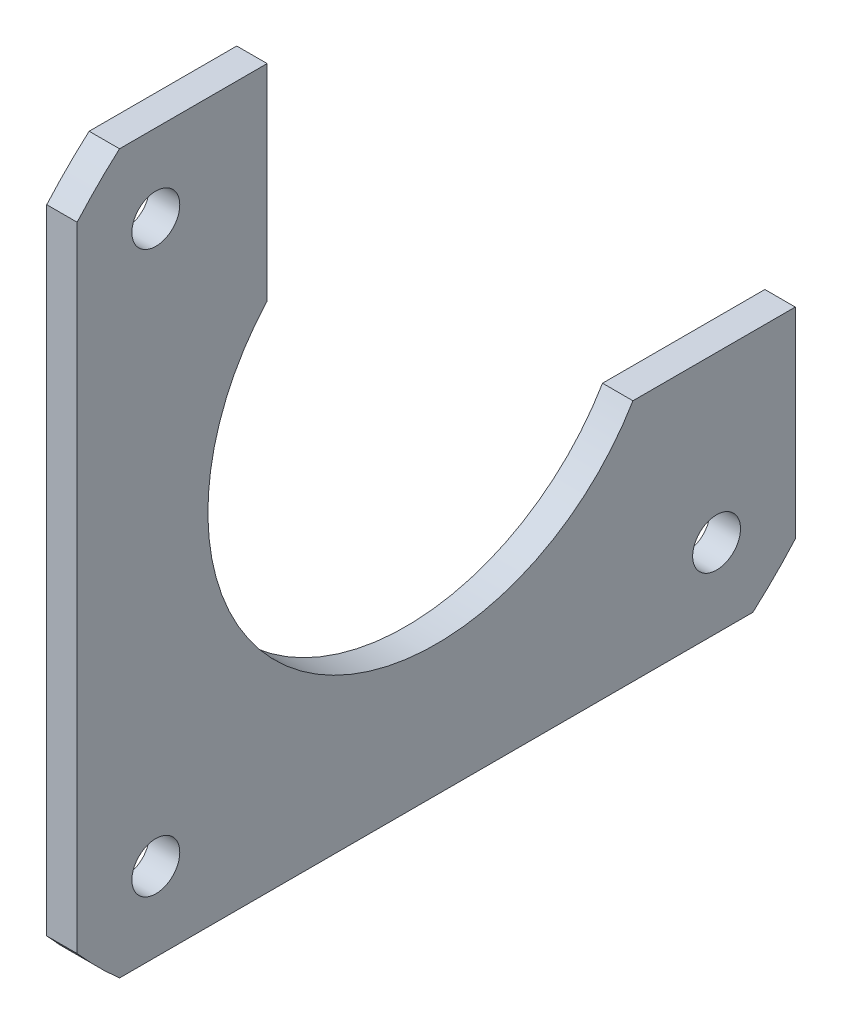
ISO-10303-21;
HEADER;
FILE_DESCRIPTION(('STEP AP214'),'2;1');
FILE_NAME('part.step','',(''),(''),'','','');
FILE_SCHEMA(('AUTOMOTIVE_DESIGN { 1 0 10303 214 1 1 1 1 }'));
ENDSEC;
DATA;
#1=APPLICATION_CONTEXT('core data for automotive mechanical design processes');
#2=APPLICATION_PROTOCOL_DEFINITION('international standard','automotive_design',2000,#1);
#3=PRODUCT_CONTEXT('',#1,'mechanical');
#4=PRODUCT('Part','Part','',(#3));
#5=PRODUCT_RELATED_PRODUCT_CATEGORY('part','',(#4));
#6=PRODUCT_DEFINITION_FORMATION('','',#4);
#7=PRODUCT_DEFINITION_CONTEXT('part definition',#1,'design');
#8=PRODUCT_DEFINITION('design','',#6,#7);
#9=PRODUCT_DEFINITION_SHAPE('','',#8);
#10=(LENGTH_UNIT() NAMED_UNIT(*) SI_UNIT(.MILLI.,.METRE.));
#11=(NAMED_UNIT(*) PLANE_ANGLE_UNIT() SI_UNIT($,.RADIAN.));
#12=(NAMED_UNIT(*) SI_UNIT($,.STERADIAN.) SOLID_ANGLE_UNIT());
#13=UNCERTAINTY_MEASURE_WITH_UNIT(LENGTH_MEASURE(1.E-05),#10,'distance_accuracy_value','');
#14=(GEOMETRIC_REPRESENTATION_CONTEXT(3) GLOBAL_UNCERTAINTY_ASSIGNED_CONTEXT((#13)) GLOBAL_UNIT_ASSIGNED_CONTEXT((#10,
#11,#12)) REPRESENTATION_CONTEXT('',''));
#15=CARTESIAN_POINT('',(0.,0.,0.));
#16=DIRECTION('',(0.,0.,1.));
#17=DIRECTION('',(1.,0.,0.));
#18=AXIS2_PLACEMENT_3D('',#15,#16,#17);
#19=CARTESIAN_POINT('',(2.54,0.,0.));
#20=DIRECTION('',(1.,0.,0.));
#21=DIRECTION('',(0.,0.,-1.));
#22=AXIS2_PLACEMENT_3D('',#19,#20,#21);
#23=PLANE('',#22);
#24=DIRECTION('',(0.,0.,-1.));
#25=VECTOR('',#24,1.);
#26=CARTESIAN_POINT('',(2.54,-9.67999999999999,-16.4363385521229));
#27=LINE('',#26,#25);
#28=CARTESIAN_POINT('',(2.54,-9.67999999999999,-16.4363385521229));
#29=VERTEX_POINT('',#28);
#30=CARTESIAN_POINT('',(2.54,-9.67999999999999,-30.));
#31=VERTEX_POINT('',#30);
#32=EDGE_CURVE('E119',#29,#31,#27,.T.);
#33=ORIENTED_EDGE('',*,*,#32,.F.);
#34=CARTESIAN_POINT('',(2.54,0.,0.));
#35=DIRECTION('',(1.,0.,0.));
#36=DIRECTION('',(0.,0.,-1.));
#37=AXIS2_PLACEMENT_3D('',#34,#35,#36);
#38=CIRCLE('',#37,19.075);
#39=CARTESIAN_POINT('',(2.54,12.8195163715329,14.125));
#40=VERTEX_POINT('',#39);
#41=EDGE_CURVE('E132',#40,#29,#38,.T.);
#42=ORIENTED_EDGE('',*,*,#41,.F.);
#43=DIRECTION('',(0.,-1.,0.));
#44=VECTOR('',#43,1.);
#45=CARTESIAN_POINT('',(2.54,30.,14.125));
#46=LINE('',#45,#44);
#47=CARTESIAN_POINT('',(2.54,30.,14.125));
#48=VERTEX_POINT('',#47);
#49=EDGE_CURVE('E58',#48,#40,#46,.T.);
#50=ORIENTED_EDGE('',*,*,#49,.F.);
#51=DIRECTION('',(0.,0.,1.));
#52=VECTOR('',#51,1.);
#53=CARTESIAN_POINT('',(2.54,30.,-26.4575131106459));
#54=LINE('',#53,#52);
#55=CARTESIAN_POINT('',(2.54,30.,26.4575131106459));
#56=VERTEX_POINT('',#55);
#57=EDGE_CURVE('E125',#48,#56,#54,.T.);
#58=ORIENTED_EDGE('',*,*,#57,.T.);
#59=CARTESIAN_POINT('',(2.54,0.,0.));
#60=DIRECTION('',(1.,0.,0.));
#61=DIRECTION('',(0.,0.,-1.));
#62=AXIS2_PLACEMENT_3D('',#59,#60,#61);
#63=CIRCLE('',#62,40.);
#64=CARTESIAN_POINT('',(2.54,26.4575131106459,30.));
#65=VERTEX_POINT('',#64);
#66=EDGE_CURVE('E193',#56,#65,#63,.T.);
#67=ORIENTED_EDGE('',*,*,#66,.T.);
#68=DIRECTION('',(0.,-1.,0.));
#69=VECTOR('',#68,1.);
#70=CARTESIAN_POINT('',(2.54,26.4575131106459,30.));
#71=LINE('',#70,#69);
#72=CARTESIAN_POINT('',(2.54,-26.4575131106459,30.));
#73=VERTEX_POINT('',#72);
#74=EDGE_CURVE('E170',#65,#73,#71,.T.);
#75=ORIENTED_EDGE('',*,*,#74,.T.);
#76=CARTESIAN_POINT('',(2.54,0.,0.));
#77=DIRECTION('',(1.,0.,0.));
#78=DIRECTION('',(0.,0.,-1.));
#79=AXIS2_PLACEMENT_3D('',#76,#77,#78);
#80=CIRCLE('',#79,40.);
#81=CARTESIAN_POINT('',(2.54,-30.,26.4575131106459));
#82=VERTEX_POINT('',#81);
#83=EDGE_CURVE('E188',#73,#82,#80,.T.);
#84=ORIENTED_EDGE('',*,*,#83,.T.);
#85=DIRECTION('',(0.,0.,-1.));
#86=VECTOR('',#85,1.);
#87=CARTESIAN_POINT('',(2.54,-30.,26.4575131106459));
#88=LINE('',#87,#86);
#89=CARTESIAN_POINT('',(2.54,-30.,-26.4575131106459));
#90=VERTEX_POINT('',#89);
#91=EDGE_CURVE('E184',#82,#90,#88,.T.);
#92=ORIENTED_EDGE('',*,*,#91,.T.);
#93=CARTESIAN_POINT('',(2.54,0.,0.));
#94=DIRECTION('',(1.,0.,0.));
#95=DIRECTION('',(0.,0.,-1.));
#96=AXIS2_PLACEMENT_3D('',#93,#94,#95);
#97=CIRCLE('',#96,40.);
#98=CARTESIAN_POINT('',(2.54,-26.4575131106459,-30.));
#99=VERTEX_POINT('',#98);
#100=EDGE_CURVE('E187',#90,#99,#97,.T.);
#101=ORIENTED_EDGE('',*,*,#100,.T.);
#102=DIRECTION('',(0.,1.,0.));
#103=VECTOR('',#102,1.);
#104=CARTESIAN_POINT('',(2.54,-26.4575131106459,-30.));
#105=LINE('',#104,#103);
#106=EDGE_CURVE('E140',#99,#31,#105,.T.);
#107=ORIENTED_EDGE('',*,*,#106,.T.);
#108=EDGE_LOOP('',(#33,#42,#50,#58,#67,#75,#84,#92,#101,#107));
#109=FACE_BOUND('',#108,.T.);
#110=CARTESIAN_POINT('',(2.54,-23.425,23.425));
#111=DIRECTION('',(1.,0.,0.));
#112=DIRECTION('',(0.,0.,-1.));
#113=AXIS2_PLACEMENT_3D('',#110,#111,#112);
#114=CIRCLE('',#113,2.);
#115=CARTESIAN_POINT('',(2.54,-23.425,21.425));
#116=VERTEX_POINT('',#115);
#117=EDGE_CURVE('E200',#116,#116,#114,.T.);
#118=ORIENTED_EDGE('',*,*,#117,.F.);
#119=EDGE_LOOP('',(#118));
#120=FACE_BOUND('',#119,.T.);
#121=CARTESIAN_POINT('',(2.54,-23.425,-23.425));
#122=DIRECTION('',(1.,0.,0.));
#123=DIRECTION('',(0.,0.,-1.));
#124=AXIS2_PLACEMENT_3D('',#121,#122,#123);
#125=CIRCLE('',#124,2.);
#126=CARTESIAN_POINT('',(2.54,-23.425,-25.425));
#127=VERTEX_POINT('',#126);
#128=EDGE_CURVE('E206',#127,#127,#125,.T.);
#129=ORIENTED_EDGE('',*,*,#128,.F.);
#130=EDGE_LOOP('',(#129));
#131=FACE_BOUND('',#130,.T.);
#132=CARTESIAN_POINT('',(2.54,23.425,23.425));
#133=DIRECTION('',(1.,0.,0.));
#134=DIRECTION('',(0.,0.,-1.));
#135=AXIS2_PLACEMENT_3D('',#132,#133,#134);
#136=CIRCLE('',#135,2.);
#137=CARTESIAN_POINT('',(2.54,23.425,21.425));
#138=VERTEX_POINT('',#137);
#139=EDGE_CURVE('E212',#138,#138,#136,.T.);
#140=ORIENTED_EDGE('',*,*,#139,.F.);
#141=EDGE_LOOP('',(#140));
#142=FACE_BOUND('',#141,.T.);
#143=ADVANCED_FACE('F35',(#109,#120,#131,#142),#23,.T.);
#144=CARTESIAN_POINT('',(0.,0.,0.));
#145=DIRECTION('',(1.,0.,0.));
#146=DIRECTION('',(0.,0.,-1.));
#147=AXIS2_PLACEMENT_3D('',#144,#145,#146);
#148=PLANE('',#147);
#149=CARTESIAN_POINT('',(0.,0.,0.));
#150=DIRECTION('',(1.,0.,0.));
#151=DIRECTION('',(0.,0.,-1.));
#152=AXIS2_PLACEMENT_3D('',#149,#150,#151);
#153=CIRCLE('',#152,19.075);
#154=CARTESIAN_POINT('',(0.,12.8195163715329,14.125));
#155=VERTEX_POINT('',#154);
#156=CARTESIAN_POINT('',(0.,-9.67999999999998,-16.4363385521229));
#157=VERTEX_POINT('',#156);
#158=EDGE_CURVE('E137',#155,#157,#153,.T.);
#159=ORIENTED_EDGE('',*,*,#158,.T.);
#160=DIRECTION('',(0.,0.,-1.));
#161=VECTOR('',#160,1.);
#162=CARTESIAN_POINT('',(0.,-9.67999999999999,-16.4363385521229));
#163=LINE('',#162,#161);
#164=CARTESIAN_POINT('',(0.,-9.67999999999999,-30.));
#165=VERTEX_POINT('',#164);
#166=EDGE_CURVE('E50',#157,#165,#163,.T.);
#167=ORIENTED_EDGE('',*,*,#166,.T.);
#168=DIRECTION('',(0.,1.,0.));
#169=VECTOR('',#168,1.);
#170=CARTESIAN_POINT('',(0.,-26.4575131106459,-30.));
#171=LINE('',#170,#169);
#172=CARTESIAN_POINT('',(0.,-26.4575131106459,-30.));
#173=VERTEX_POINT('',#172);
#174=EDGE_CURVE('E150',#173,#165,#171,.T.);
#175=ORIENTED_EDGE('',*,*,#174,.F.);
#176=CARTESIAN_POINT('',(0.,0.,0.));
#177=DIRECTION('',(1.,0.,0.));
#178=DIRECTION('',(0.,0.,-1.));
#179=AXIS2_PLACEMENT_3D('',#176,#177,#178);
#180=CIRCLE('',#179,40.);
#181=CARTESIAN_POINT('',(0.,-30.,-26.4575131106459));
#182=VERTEX_POINT('',#181);
#183=EDGE_CURVE('E148',#182,#173,#180,.T.);
#184=ORIENTED_EDGE('',*,*,#183,.F.);
#185=DIRECTION('',(0.,0.,-1.));
#186=VECTOR('',#185,1.);
#187=CARTESIAN_POINT('',(0.,-30.,26.4575131106459));
#188=LINE('',#187,#186);
#189=CARTESIAN_POINT('',(0.,-30.,26.4575131106459));
#190=VERTEX_POINT('',#189);
#191=EDGE_CURVE('E146',#190,#182,#188,.T.);
#192=ORIENTED_EDGE('',*,*,#191,.F.);
#193=CARTESIAN_POINT('',(0.,0.,0.));
#194=DIRECTION('',(1.,0.,0.));
#195=DIRECTION('',(0.,0.,-1.));
#196=AXIS2_PLACEMENT_3D('',#193,#194,#195);
#197=CIRCLE('',#196,40.);
#198=CARTESIAN_POINT('',(0.,-26.4575131106459,30.));
#199=VERTEX_POINT('',#198);
#200=EDGE_CURVE('E144',#199,#190,#197,.T.);
#201=ORIENTED_EDGE('',*,*,#200,.F.);
#202=DIRECTION('',(0.,-1.,0.));
#203=VECTOR('',#202,1.);
#204=CARTESIAN_POINT('',(0.,26.4575131106459,30.));
#205=LINE('',#204,#203);
#206=CARTESIAN_POINT('',(0.,26.4575131106459,30.));
#207=VERTEX_POINT('',#206);
#208=EDGE_CURVE('E134',#207,#199,#205,.T.);
#209=ORIENTED_EDGE('',*,*,#208,.F.);
#210=CARTESIAN_POINT('',(0.,0.,0.));
#211=DIRECTION('',(1.,0.,0.));
#212=DIRECTION('',(0.,0.,-1.));
#213=AXIS2_PLACEMENT_3D('',#210,#211,#212);
#214=CIRCLE('',#213,40.);
#215=CARTESIAN_POINT('',(0.,30.,26.4575131106459));
#216=VERTEX_POINT('',#215);
#217=EDGE_CURVE('E131',#216,#207,#214,.T.);
#218=ORIENTED_EDGE('',*,*,#217,.F.);
#219=DIRECTION('',(0.,0.,1.));
#220=VECTOR('',#219,1.);
#221=CARTESIAN_POINT('',(0.,30.,-26.4575131106459));
#222=LINE('',#221,#220);
#223=CARTESIAN_POINT('',(0.,30.,14.125));
#224=VERTEX_POINT('',#223);
#225=EDGE_CURVE('E124',#224,#216,#222,.T.);
#226=ORIENTED_EDGE('',*,*,#225,.F.);
#227=DIRECTION('',(0.,-1.,0.));
#228=VECTOR('',#227,1.);
#229=CARTESIAN_POINT('',(0.,30.,14.125));
#230=LINE('',#229,#228);
#231=EDGE_CURVE('E110',#224,#155,#230,.T.);
#232=ORIENTED_EDGE('',*,*,#231,.T.);
#233=EDGE_LOOP('',(#159,#167,#175,#184,#192,#201,#209,#218,#226,#232));
#234=FACE_BOUND('',#233,.T.);
#235=CARTESIAN_POINT('',(0.,-23.425,23.425));
#236=DIRECTION('',(1.,0.,0.));
#237=DIRECTION('',(0.,0.,-1.));
#238=AXIS2_PLACEMENT_3D('',#235,#236,#237);
#239=CIRCLE('',#238,2.);
#240=CARTESIAN_POINT('',(0.,-23.425,21.425));
#241=VERTEX_POINT('',#240);
#242=EDGE_CURVE('E196',#241,#241,#239,.F.);
#243=ORIENTED_EDGE('',*,*,#242,.F.);
#244=EDGE_LOOP('',(#243));
#245=FACE_BOUND('',#244,.T.);
#246=CARTESIAN_POINT('',(0.,-23.425,-23.425));
#247=DIRECTION('',(1.,0.,0.));
#248=DIRECTION('',(0.,0.,-1.));
#249=AXIS2_PLACEMENT_3D('',#246,#247,#248);
#250=CIRCLE('',#249,2.);
#251=CARTESIAN_POINT('',(0.,-23.425,-25.425));
#252=VERTEX_POINT('',#251);
#253=EDGE_CURVE('E203',#252,#252,#250,.F.);
#254=ORIENTED_EDGE('',*,*,#253,.F.);
#255=EDGE_LOOP('',(#254));
#256=FACE_BOUND('',#255,.T.);
#257=CARTESIAN_POINT('',(0.,23.425,23.425));
#258=DIRECTION('',(1.,0.,0.));
#259=DIRECTION('',(0.,0.,-1.));
#260=AXIS2_PLACEMENT_3D('',#257,#258,#259);
#261=CIRCLE('',#260,2.);
#262=CARTESIAN_POINT('',(0.,23.425,21.425));
#263=VERTEX_POINT('',#262);
#264=EDGE_CURVE('E209',#263,#263,#261,.F.);
#265=ORIENTED_EDGE('',*,*,#264,.F.);
#266=EDGE_LOOP('',(#265));
#267=FACE_BOUND('',#266,.T.);
#268=ADVANCED_FACE('F128',(#234,#245,#256,#267),#148,.F.);
#269=CARTESIAN_POINT('',(2.54,30.,-26.4575131106459));
#270=DIRECTION('',(0.,-1.,0.));
#271=DIRECTION('',(0.,0.,-1.));
#272=AXIS2_PLACEMENT_3D('',#269,#270,#271);
#273=PLANE('',#272);
#274=ORIENTED_EDGE('',*,*,#57,.F.);
#275=DIRECTION('',(1.,0.,0.));
#276=VECTOR('',#275,1.);
#277=CARTESIAN_POINT('',(0.,30.,14.125));
#278=LINE('',#277,#276);
#279=EDGE_CURVE('E113',#224,#48,#278,.T.);
#280=ORIENTED_EDGE('',*,*,#279,.F.);
#281=ORIENTED_EDGE('',*,*,#225,.T.);
#282=DIRECTION('',(-1.,0.,0.));
#283=VECTOR('',#282,1.);
#284=CARTESIAN_POINT('',(2.54,30.,26.4575131106459));
#285=LINE('',#284,#283);
#286=EDGE_CURVE('E11',#56,#216,#285,.T.);
#287=ORIENTED_EDGE('',*,*,#286,.F.);
#288=EDGE_LOOP('',(#274,#280,#281,#287));
#289=FACE_BOUND('',#288,.T.);
#290=ADVANCED_FACE('F37',(#289),#273,.F.);
#291=CARTESIAN_POINT('',(2.54,0.,0.));
#292=DIRECTION('',(-1.,0.,0.));
#293=DIRECTION('',(0.,0.,1.));
#294=AXIS2_PLACEMENT_3D('',#291,#292,#293);
#295=CYLINDRICAL_SURFACE('',#294,40.);
#296=ORIENTED_EDGE('',*,*,#217,.T.);
#297=DIRECTION('',(-1.,0.,0.));
#298=VECTOR('',#297,1.);
#299=CARTESIAN_POINT('',(2.54,26.4575131106459,30.));
#300=LINE('',#299,#298);
#301=EDGE_CURVE('E43',#65,#207,#300,.T.);
#302=ORIENTED_EDGE('',*,*,#301,.F.);
#303=ORIENTED_EDGE('',*,*,#66,.F.);
#304=ORIENTED_EDGE('',*,*,#286,.T.);
#305=EDGE_LOOP('',(#296,#302,#303,#304));
#306=FACE_BOUND('',#305,.T.);
#307=ADVANCED_FACE('F262',(#306),#295,.T.);
#308=CARTESIAN_POINT('',(2.54,26.4575131106459,30.));
#309=DIRECTION('',(0.,0.,-1.));
#310=DIRECTION('',(0.,1.,0.));
#311=AXIS2_PLACEMENT_3D('',#308,#309,#310);
#312=PLANE('',#311);
#313=ORIENTED_EDGE('',*,*,#208,.T.);
#314=DIRECTION('',(-1.,0.,0.));
#315=VECTOR('',#314,1.);
#316=CARTESIAN_POINT('',(2.54,-26.4575131106459,30.));
#317=LINE('',#316,#315);
#318=EDGE_CURVE('E162',#73,#199,#317,.T.);
#319=ORIENTED_EDGE('',*,*,#318,.F.);
#320=ORIENTED_EDGE('',*,*,#74,.F.);
#321=ORIENTED_EDGE('',*,*,#301,.T.);
#322=EDGE_LOOP('',(#313,#319,#320,#321));
#323=FACE_BOUND('',#322,.T.);
#324=ADVANCED_FACE('F168',(#323),#312,.F.);
#325=CARTESIAN_POINT('',(2.54,0.,0.));
#326=DIRECTION('',(-1.,0.,0.));
#327=DIRECTION('',(0.,0.,1.));
#328=AXIS2_PLACEMENT_3D('',#325,#326,#327);
#329=CYLINDRICAL_SURFACE('',#328,40.);
#330=ORIENTED_EDGE('',*,*,#200,.T.);
#331=DIRECTION('',(-1.,0.,0.));
#332=VECTOR('',#331,1.);
#333=CARTESIAN_POINT('',(2.54,-30.,26.4575131106459));
#334=LINE('',#333,#332);
#335=EDGE_CURVE('E159',#82,#190,#334,.T.);
#336=ORIENTED_EDGE('',*,*,#335,.F.);
#337=ORIENTED_EDGE('',*,*,#83,.F.);
#338=ORIENTED_EDGE('',*,*,#318,.T.);
#339=EDGE_LOOP('',(#330,#336,#337,#338));
#340=FACE_BOUND('',#339,.T.);
#341=ADVANCED_FACE('F178',(#340),#329,.T.);
#342=CARTESIAN_POINT('',(2.54,-30.,26.4575131106459));
#343=DIRECTION('',(0.,1.,0.));
#344=DIRECTION('',(0.,0.,1.));
#345=AXIS2_PLACEMENT_3D('',#342,#343,#344);
#346=PLANE('',#345);
#347=ORIENTED_EDGE('',*,*,#191,.T.);
#348=DIRECTION('',(-1.,0.,0.));
#349=VECTOR('',#348,1.);
#350=CARTESIAN_POINT('',(2.54,-30.,-26.4575131106459));
#351=LINE('',#350,#349);
#352=EDGE_CURVE('E156',#90,#182,#351,.T.);
#353=ORIENTED_EDGE('',*,*,#352,.F.);
#354=ORIENTED_EDGE('',*,*,#91,.F.);
#355=ORIENTED_EDGE('',*,*,#335,.T.);
#356=EDGE_LOOP('',(#347,#353,#354,#355));
#357=FACE_BOUND('',#356,.T.);
#358=ADVANCED_FACE('F182',(#357),#346,.F.);
#359=CARTESIAN_POINT('',(2.54,0.,0.));
#360=DIRECTION('',(-1.,0.,0.));
#361=DIRECTION('',(0.,0.,1.));
#362=AXIS2_PLACEMENT_3D('',#359,#360,#361);
#363=CYLINDRICAL_SURFACE('',#362,40.);
#364=ORIENTED_EDGE('',*,*,#183,.T.);
#365=DIRECTION('',(-1.,0.,0.));
#366=VECTOR('',#365,1.);
#367=CARTESIAN_POINT('',(2.54,-26.4575131106459,-30.));
#368=LINE('',#367,#366);
#369=EDGE_CURVE('E153',#99,#173,#368,.T.);
#370=ORIENTED_EDGE('',*,*,#369,.F.);
#371=ORIENTED_EDGE('',*,*,#100,.F.);
#372=ORIENTED_EDGE('',*,*,#352,.T.);
#373=EDGE_LOOP('',(#364,#370,#371,#372));
#374=FACE_BOUND('',#373,.T.);
#375=ADVANCED_FACE('F230',(#374),#363,.T.);
#376=CARTESIAN_POINT('',(2.54,-26.4575131106459,-30.));
#377=DIRECTION('',(0.,0.,1.));
#378=DIRECTION('',(0.,-1.,0.));
#379=AXIS2_PLACEMENT_3D('',#376,#377,#378);
#380=PLANE('',#379);
#381=ORIENTED_EDGE('',*,*,#174,.T.);
#382=DIRECTION('',(1.,0.,0.));
#383=VECTOR('',#382,1.);
#384=CARTESIAN_POINT('',(0.,-9.67999999999999,-30.));
#385=LINE('',#384,#383);
#386=EDGE_CURVE('E214',#165,#31,#385,.T.);
#387=ORIENTED_EDGE('',*,*,#386,.T.);
#388=ORIENTED_EDGE('',*,*,#106,.F.);
#389=ORIENTED_EDGE('',*,*,#369,.T.);
#390=EDGE_LOOP('',(#381,#387,#388,#389));
#391=FACE_BOUND('',#390,.T.);
#392=ADVANCED_FACE('F225',(#391),#380,.F.);
#393=CARTESIAN_POINT('',(2.54,0.,0.));
#394=DIRECTION('',(-1.,0.,0.));
#395=DIRECTION('',(0.,0.,1.));
#396=AXIS2_PLACEMENT_3D('',#393,#394,#395);
#397=CYLINDRICAL_SURFACE('',#396,19.075);
#398=DIRECTION('',(1.,0.,0.));
#399=VECTOR('',#398,1.);
#400=CARTESIAN_POINT('',(0.,-9.67999999999999,-16.4363385521229));
#401=LINE('',#400,#399);
#402=EDGE_CURVE('E217',#157,#29,#401,.T.);
#403=ORIENTED_EDGE('',*,*,#402,.F.);
#404=ORIENTED_EDGE('',*,*,#158,.F.);
#405=DIRECTION('',(1.,0.,0.));
#406=VECTOR('',#405,1.);
#407=CARTESIAN_POINT('',(0.,12.8195163715329,14.125));
#408=LINE('',#407,#406);
#409=EDGE_CURVE('E114',#155,#40,#408,.T.);
#410=ORIENTED_EDGE('',*,*,#409,.T.);
#411=ORIENTED_EDGE('',*,*,#41,.T.);
#412=EDGE_LOOP('',(#403,#404,#410,#411));
#413=FACE_BOUND('',#412,.T.);
#414=ADVANCED_FACE('F235',(#413),#397,.F.);
#415=CARTESIAN_POINT('',(-7.56604255869606,-23.425,23.425));
#416=DIRECTION('',(1.,0.,0.));
#417=DIRECTION('',(0.,0.,-1.));
#418=AXIS2_PLACEMENT_3D('',#415,#416,#417);
#419=CYLINDRICAL_SURFACE('',#418,2.);
#420=CARTESIAN_POINT('',(0.,-23.425,21.425));
#421=CARTESIAN_POINT('',(0.0264583333333326,-23.425,21.425));
#422=CARTESIAN_POINT('',(0.0529166666666661,-23.425,21.425));
#423=CARTESIAN_POINT('',(0.105833333333333,-23.425,21.425));
#424=CARTESIAN_POINT('',(0.132291666666666,-23.425,21.425));
#425=CARTESIAN_POINT('',(0.185208333333333,-23.425,21.425));
#426=CARTESIAN_POINT('',(0.211666666666666,-23.425,21.425));
#427=CARTESIAN_POINT('',(0.264583333333333,-23.425,21.425));
#428=CARTESIAN_POINT('',(0.291041666666665,-23.425,21.425));
#429=CARTESIAN_POINT('',(0.343958333333332,-23.425,21.425));
#430=CARTESIAN_POINT('',(0.370416666666665,-23.425,21.425));
#431=CARTESIAN_POINT('',(0.423333333333332,-23.425,21.425));
#432=CARTESIAN_POINT('',(0.449791666666665,-23.425,21.425));
#433=CARTESIAN_POINT('',(0.502708333333332,-23.425,21.425));
#434=CARTESIAN_POINT('',(0.529166666666666,-23.425,21.425));
#435=CARTESIAN_POINT('',(0.582083333333332,-23.425,21.425));
#436=CARTESIAN_POINT('',(0.608541666666665,-23.425,21.425));
#437=CARTESIAN_POINT('',(0.661458333333332,-23.425,21.425));
#438=CARTESIAN_POINT('',(0.687916666666666,-23.425,21.425));
#439=CARTESIAN_POINT('',(0.740833333333333,-23.425,21.425));
#440=CARTESIAN_POINT('',(0.767291666666666,-23.425,21.425));
#441=CARTESIAN_POINT('',(0.820208333333333,-23.425,21.425));
#442=CARTESIAN_POINT('',(0.846666666666666,-23.425,21.425));
#443=CARTESIAN_POINT('',(0.899583333333332,-23.425,21.425));
#444=CARTESIAN_POINT('',(0.926041666666665,-23.425,21.425));
#445=CARTESIAN_POINT('',(0.978958333333332,-23.425,21.425));
#446=CARTESIAN_POINT('',(1.00541666666667,-23.425,21.425));
#447=CARTESIAN_POINT('',(1.05833333333333,-23.425,21.425));
#448=CARTESIAN_POINT('',(1.08479166666667,-23.425,21.425));
#449=CARTESIAN_POINT('',(1.13770833333333,-23.425,21.425));
#450=CARTESIAN_POINT('',(1.16416666666667,-23.425,21.425));
#451=CARTESIAN_POINT('',(1.21708333333333,-23.425,21.425));
#452=CARTESIAN_POINT('',(1.24354166666667,-23.425,21.425));
#453=CARTESIAN_POINT('',(1.29645833333333,-23.425,21.425));
#454=CARTESIAN_POINT('',(1.32291666666667,-23.425,21.425));
#455=CARTESIAN_POINT('',(1.37583333333333,-23.425,21.425));
#456=CARTESIAN_POINT('',(1.40229166666667,-23.425,21.425));
#457=CARTESIAN_POINT('',(1.45520833333333,-23.425,21.425));
#458=CARTESIAN_POINT('',(1.48166666666667,-23.425,21.425));
#459=CARTESIAN_POINT('',(1.53458333333333,-23.425,21.425));
#460=CARTESIAN_POINT('',(1.56104166666667,-23.425,21.425));
#461=CARTESIAN_POINT('',(1.61395833333333,-23.425,21.425));
#462=CARTESIAN_POINT('',(1.64041666666667,-23.425,21.425));
#463=CARTESIAN_POINT('',(1.69333333333333,-23.425,21.425));
#464=CARTESIAN_POINT('',(1.71979166666667,-23.425,21.425));
#465=CARTESIAN_POINT('',(1.77270833333333,-23.425,21.425));
#466=CARTESIAN_POINT('',(1.79916666666667,-23.425,21.425));
#467=CARTESIAN_POINT('',(1.85208333333333,-23.425,21.425));
#468=CARTESIAN_POINT('',(1.87854166666667,-23.425,21.425));
#469=CARTESIAN_POINT('',(1.93145833333333,-23.425,21.425));
#470=CARTESIAN_POINT('',(1.95791666666667,-23.425,21.425));
#471=CARTESIAN_POINT('',(2.01083333333333,-23.425,21.425));
#472=CARTESIAN_POINT('',(2.03729166666667,-23.425,21.425));
#473=CARTESIAN_POINT('',(2.09020833333333,-23.425,21.425));
#474=CARTESIAN_POINT('',(2.11666666666667,-23.425,21.425));
#475=CARTESIAN_POINT('',(2.16958333333333,-23.425,21.425));
#476=CARTESIAN_POINT('',(2.19604166666667,-23.425,21.425));
#477=CARTESIAN_POINT('',(2.24895833333333,-23.425,21.425));
#478=CARTESIAN_POINT('',(2.27541666666667,-23.425,21.425));
#479=CARTESIAN_POINT('',(2.32833333333333,-23.425,21.425));
#480=CARTESIAN_POINT('',(2.35479166666667,-23.425,21.425));
#481=CARTESIAN_POINT('',(2.40770833333333,-23.425,21.425));
#482=CARTESIAN_POINT('',(2.43416666666667,-23.425,21.425));
#483=CARTESIAN_POINT('',(2.48708333333333,-23.425,21.425));
#484=CARTESIAN_POINT('',(2.51354166666667,-23.425,21.425));
#485=CARTESIAN_POINT('',(2.54,-23.425,21.425));
#486=B_SPLINE_CURVE_WITH_KNOTS('',3,(#420,#421,#422,#423,#424,#425,#426,#427,#428,#429,#430,
#431,#432,#433,#434,#435,#436,#437,#438,#439,#440,#441,#442,#443,#444,#445,#446,#447,#448,#449,
#450,#451,#452,#453,#454,#455,#456,#457,#458,#459,#460,#461,#462,#463,#464,#465,#466,#467,#468,
#469,#470,#471,#472,#473,#474,#475,#476,#477,#478,#479,#480,#481,#482,#483,#484,#485),
.UNSPECIFIED.,.F.,.F.,(4,2,2,2,2,2,2,2,2,2,2,2,2,2,2,2,2,2,2,2,2,2,2,2,2,2,2,2,2,2,2,2,4),(0.,
0.0793750000000004,0.15875,0.238125,0.317499999999999,0.396874999999999,0.47625,0.555625,
0.634999999999999,0.714375000000001,0.79375,0.873125,0.952499999999999,1.031875,1.11125,
1.190625,1.27,1.349375,1.42875,1.508125,1.5875,1.666875,1.74625,1.825625,1.905,1.984375,2.06375,
2.143125,2.2225,2.301875,2.38125,2.460625,2.54),.UNSPECIFIED.);
#487=EDGE_CURVE('BSEAM302',#241,#116,#486,.T.);
#488=ORIENTED_EDGE('',*,*,#242,.T.);
#489=ORIENTED_EDGE('',*,*,#117,.T.);
#490=ORIENTED_EDGE('',*,*,#487,.T.);
#491=ORIENTED_EDGE('',*,*,#487,.F.);
#492=EDGE_LOOP('',(#488,#490,#489,#491));
#493=FACE_BOUND('',#492,.T.);
#494=ADVANCED_FACE('F302',(#493),#419,.F.);
#495=CARTESIAN_POINT('',(-7.56604255869606,-23.425,-23.425));
#496=DIRECTION('',(1.,0.,0.));
#497=DIRECTION('',(0.,0.,-1.));
#498=AXIS2_PLACEMENT_3D('',#495,#496,#497);
#499=CYLINDRICAL_SURFACE('',#498,2.);
#500=CARTESIAN_POINT('',(0.,-23.425,-25.425));
#501=CARTESIAN_POINT('',(0.0264583333333326,-23.425,-25.425));
#502=CARTESIAN_POINT('',(0.0529166666666661,-23.425,-25.425));
#503=CARTESIAN_POINT('',(0.105833333333333,-23.425,-25.425));
#504=CARTESIAN_POINT('',(0.132291666666666,-23.425,-25.425));
#505=CARTESIAN_POINT('',(0.185208333333333,-23.425,-25.425));
#506=CARTESIAN_POINT('',(0.211666666666666,-23.425,-25.425));
#507=CARTESIAN_POINT('',(0.264583333333333,-23.425,-25.425));
#508=CARTESIAN_POINT('',(0.291041666666665,-23.425,-25.425));
#509=CARTESIAN_POINT('',(0.343958333333332,-23.425,-25.425));
#510=CARTESIAN_POINT('',(0.370416666666665,-23.425,-25.425));
#511=CARTESIAN_POINT('',(0.423333333333332,-23.425,-25.425));
#512=CARTESIAN_POINT('',(0.449791666666665,-23.425,-25.425));
#513=CARTESIAN_POINT('',(0.502708333333332,-23.425,-25.425));
#514=CARTESIAN_POINT('',(0.529166666666666,-23.425,-25.425));
#515=CARTESIAN_POINT('',(0.582083333333332,-23.425,-25.425));
#516=CARTESIAN_POINT('',(0.608541666666665,-23.425,-25.425));
#517=CARTESIAN_POINT('',(0.661458333333332,-23.425,-25.425));
#518=CARTESIAN_POINT('',(0.687916666666666,-23.425,-25.425));
#519=CARTESIAN_POINT('',(0.740833333333333,-23.425,-25.425));
#520=CARTESIAN_POINT('',(0.767291666666666,-23.425,-25.425));
#521=CARTESIAN_POINT('',(0.820208333333333,-23.425,-25.425));
#522=CARTESIAN_POINT('',(0.846666666666666,-23.425,-25.425));
#523=CARTESIAN_POINT('',(0.899583333333332,-23.425,-25.425));
#524=CARTESIAN_POINT('',(0.926041666666665,-23.425,-25.425));
#525=CARTESIAN_POINT('',(0.978958333333332,-23.425,-25.425));
#526=CARTESIAN_POINT('',(1.00541666666667,-23.425,-25.425));
#527=CARTESIAN_POINT('',(1.05833333333333,-23.425,-25.425));
#528=CARTESIAN_POINT('',(1.08479166666667,-23.425,-25.425));
#529=CARTESIAN_POINT('',(1.13770833333333,-23.425,-25.425));
#530=CARTESIAN_POINT('',(1.16416666666667,-23.425,-25.425));
#531=CARTESIAN_POINT('',(1.21708333333333,-23.425,-25.425));
#532=CARTESIAN_POINT('',(1.24354166666667,-23.425,-25.425));
#533=CARTESIAN_POINT('',(1.29645833333333,-23.425,-25.425));
#534=CARTESIAN_POINT('',(1.32291666666667,-23.425,-25.425));
#535=CARTESIAN_POINT('',(1.37583333333333,-23.425,-25.425));
#536=CARTESIAN_POINT('',(1.40229166666667,-23.425,-25.425));
#537=CARTESIAN_POINT('',(1.45520833333333,-23.425,-25.425));
#538=CARTESIAN_POINT('',(1.48166666666667,-23.425,-25.425));
#539=CARTESIAN_POINT('',(1.53458333333333,-23.425,-25.425));
#540=CARTESIAN_POINT('',(1.56104166666667,-23.425,-25.425));
#541=CARTESIAN_POINT('',(1.61395833333333,-23.425,-25.425));
#542=CARTESIAN_POINT('',(1.64041666666667,-23.425,-25.425));
#543=CARTESIAN_POINT('',(1.69333333333333,-23.425,-25.425));
#544=CARTESIAN_POINT('',(1.71979166666667,-23.425,-25.425));
#545=CARTESIAN_POINT('',(1.77270833333333,-23.425,-25.425));
#546=CARTESIAN_POINT('',(1.79916666666667,-23.425,-25.425));
#547=CARTESIAN_POINT('',(1.85208333333333,-23.425,-25.425));
#548=CARTESIAN_POINT('',(1.87854166666667,-23.425,-25.425));
#549=CARTESIAN_POINT('',(1.93145833333333,-23.425,-25.425));
#550=CARTESIAN_POINT('',(1.95791666666667,-23.425,-25.425));
#551=CARTESIAN_POINT('',(2.01083333333333,-23.425,-25.425));
#552=CARTESIAN_POINT('',(2.03729166666667,-23.425,-25.425));
#553=CARTESIAN_POINT('',(2.09020833333333,-23.425,-25.425));
#554=CARTESIAN_POINT('',(2.11666666666667,-23.425,-25.425));
#555=CARTESIAN_POINT('',(2.16958333333333,-23.425,-25.425));
#556=CARTESIAN_POINT('',(2.19604166666667,-23.425,-25.425));
#557=CARTESIAN_POINT('',(2.24895833333333,-23.425,-25.425));
#558=CARTESIAN_POINT('',(2.27541666666667,-23.425,-25.425));
#559=CARTESIAN_POINT('',(2.32833333333333,-23.425,-25.425));
#560=CARTESIAN_POINT('',(2.35479166666667,-23.425,-25.425));
#561=CARTESIAN_POINT('',(2.40770833333333,-23.425,-25.425));
#562=CARTESIAN_POINT('',(2.43416666666667,-23.425,-25.425));
#563=CARTESIAN_POINT('',(2.48708333333333,-23.425,-25.425));
#564=CARTESIAN_POINT('',(2.51354166666667,-23.425,-25.425));
#565=CARTESIAN_POINT('',(2.54,-23.425,-25.425));
#566=B_SPLINE_CURVE_WITH_KNOTS('',3,(#500,#501,#502,#503,#504,#505,#506,#507,#508,#509,#510,
#511,#512,#513,#514,#515,#516,#517,#518,#519,#520,#521,#522,#523,#524,#525,#526,#527,#528,#529,
#530,#531,#532,#533,#534,#535,#536,#537,#538,#539,#540,#541,#542,#543,#544,#545,#546,#547,#548,
#549,#550,#551,#552,#553,#554,#555,#556,#557,#558,#559,#560,#561,#562,#563,#564,#565),
.UNSPECIFIED.,.F.,.F.,(4,2,2,2,2,2,2,2,2,2,2,2,2,2,2,2,2,2,2,2,2,2,2,2,2,2,2,2,2,2,2,2,4),(0.,
0.0793750000000004,0.15875,0.238125,0.317499999999999,0.396874999999999,0.47625,0.555625,
0.634999999999999,0.714375000000001,0.79375,0.873125,0.952499999999999,1.031875,1.11125,
1.190625,1.27,1.349375,1.42875,1.508125,1.5875,1.666875,1.74625,1.825625,1.905,1.984375,2.06375,
2.143125,2.2225,2.301875,2.38125,2.460625,2.54),.UNSPECIFIED.);
#567=EDGE_CURVE('BSEAM291',#252,#127,#566,.T.);
#568=ORIENTED_EDGE('',*,*,#253,.T.);
#569=ORIENTED_EDGE('',*,*,#128,.T.);
#570=ORIENTED_EDGE('',*,*,#567,.T.);
#571=ORIENTED_EDGE('',*,*,#567,.F.);
#572=EDGE_LOOP('',(#568,#570,#569,#571));
#573=FACE_BOUND('',#572,.T.);
#574=ADVANCED_FACE('F291',(#573),#499,.F.);
#575=CARTESIAN_POINT('',(-7.56604255869606,23.425,23.425));
#576=DIRECTION('',(1.,0.,0.));
#577=DIRECTION('',(0.,0.,-1.));
#578=AXIS2_PLACEMENT_3D('',#575,#576,#577);
#579=CYLINDRICAL_SURFACE('',#578,2.);
#580=CARTESIAN_POINT('',(0.,23.425,21.425));
#581=CARTESIAN_POINT('',(0.0264583333333326,23.425,21.425));
#582=CARTESIAN_POINT('',(0.0529166666666661,23.425,21.425));
#583=CARTESIAN_POINT('',(0.105833333333333,23.425,21.425));
#584=CARTESIAN_POINT('',(0.132291666666666,23.425,21.425));
#585=CARTESIAN_POINT('',(0.185208333333333,23.425,21.425));
#586=CARTESIAN_POINT('',(0.211666666666666,23.425,21.425));
#587=CARTESIAN_POINT('',(0.264583333333333,23.425,21.425));
#588=CARTESIAN_POINT('',(0.291041666666665,23.425,21.425));
#589=CARTESIAN_POINT('',(0.343958333333332,23.425,21.425));
#590=CARTESIAN_POINT('',(0.370416666666665,23.425,21.425));
#591=CARTESIAN_POINT('',(0.423333333333332,23.425,21.425));
#592=CARTESIAN_POINT('',(0.449791666666665,23.425,21.425));
#593=CARTESIAN_POINT('',(0.502708333333332,23.425,21.425));
#594=CARTESIAN_POINT('',(0.529166666666666,23.425,21.425));
#595=CARTESIAN_POINT('',(0.582083333333332,23.425,21.425));
#596=CARTESIAN_POINT('',(0.608541666666665,23.425,21.425));
#597=CARTESIAN_POINT('',(0.661458333333332,23.425,21.425));
#598=CARTESIAN_POINT('',(0.687916666666666,23.425,21.425));
#599=CARTESIAN_POINT('',(0.740833333333333,23.425,21.425));
#600=CARTESIAN_POINT('',(0.767291666666666,23.425,21.425));
#601=CARTESIAN_POINT('',(0.820208333333333,23.425,21.425));
#602=CARTESIAN_POINT('',(0.846666666666666,23.425,21.425));
#603=CARTESIAN_POINT('',(0.899583333333332,23.425,21.425));
#604=CARTESIAN_POINT('',(0.926041666666665,23.425,21.425));
#605=CARTESIAN_POINT('',(0.978958333333332,23.425,21.425));
#606=CARTESIAN_POINT('',(1.00541666666667,23.425,21.425));
#607=CARTESIAN_POINT('',(1.05833333333333,23.425,21.425));
#608=CARTESIAN_POINT('',(1.08479166666667,23.425,21.425));
#609=CARTESIAN_POINT('',(1.13770833333333,23.425,21.425));
#610=CARTESIAN_POINT('',(1.16416666666667,23.425,21.425));
#611=CARTESIAN_POINT('',(1.21708333333333,23.425,21.425));
#612=CARTESIAN_POINT('',(1.24354166666667,23.425,21.425));
#613=CARTESIAN_POINT('',(1.29645833333333,23.425,21.425));
#614=CARTESIAN_POINT('',(1.32291666666667,23.425,21.425));
#615=CARTESIAN_POINT('',(1.37583333333333,23.425,21.425));
#616=CARTESIAN_POINT('',(1.40229166666667,23.425,21.425));
#617=CARTESIAN_POINT('',(1.45520833333333,23.425,21.425));
#618=CARTESIAN_POINT('',(1.48166666666667,23.425,21.425));
#619=CARTESIAN_POINT('',(1.53458333333333,23.425,21.425));
#620=CARTESIAN_POINT('',(1.56104166666667,23.425,21.425));
#621=CARTESIAN_POINT('',(1.61395833333333,23.425,21.425));
#622=CARTESIAN_POINT('',(1.64041666666667,23.425,21.425));
#623=CARTESIAN_POINT('',(1.69333333333333,23.425,21.425));
#624=CARTESIAN_POINT('',(1.71979166666667,23.425,21.425));
#625=CARTESIAN_POINT('',(1.77270833333333,23.425,21.425));
#626=CARTESIAN_POINT('',(1.79916666666667,23.425,21.425));
#627=CARTESIAN_POINT('',(1.85208333333333,23.425,21.425));
#628=CARTESIAN_POINT('',(1.87854166666667,23.425,21.425));
#629=CARTESIAN_POINT('',(1.93145833333333,23.425,21.425));
#630=CARTESIAN_POINT('',(1.95791666666667,23.425,21.425));
#631=CARTESIAN_POINT('',(2.01083333333333,23.425,21.425));
#632=CARTESIAN_POINT('',(2.03729166666667,23.425,21.425));
#633=CARTESIAN_POINT('',(2.09020833333333,23.425,21.425));
#634=CARTESIAN_POINT('',(2.11666666666667,23.425,21.425));
#635=CARTESIAN_POINT('',(2.16958333333333,23.425,21.425));
#636=CARTESIAN_POINT('',(2.19604166666667,23.425,21.425));
#637=CARTESIAN_POINT('',(2.24895833333333,23.425,21.425));
#638=CARTESIAN_POINT('',(2.27541666666667,23.425,21.425));
#639=CARTESIAN_POINT('',(2.32833333333333,23.425,21.425));
#640=CARTESIAN_POINT('',(2.35479166666667,23.425,21.425));
#641=CARTESIAN_POINT('',(2.40770833333333,23.425,21.425));
#642=CARTESIAN_POINT('',(2.43416666666667,23.425,21.425));
#643=CARTESIAN_POINT('',(2.48708333333333,23.425,21.425));
#644=CARTESIAN_POINT('',(2.51354166666667,23.425,21.425));
#645=CARTESIAN_POINT('',(2.54,23.425,21.425));
#646=B_SPLINE_CURVE_WITH_KNOTS('',3,(#580,#581,#582,#583,#584,#585,#586,#587,#588,#589,#590,
#591,#592,#593,#594,#595,#596,#597,#598,#599,#600,#601,#602,#603,#604,#605,#606,#607,#608,#609,
#610,#611,#612,#613,#614,#615,#616,#617,#618,#619,#620,#621,#622,#623,#624,#625,#626,#627,#628,
#629,#630,#631,#632,#633,#634,#635,#636,#637,#638,#639,#640,#641,#642,#643,#644,#645),
.UNSPECIFIED.,.F.,.F.,(4,2,2,2,2,2,2,2,2,2,2,2,2,2,2,2,2,2,2,2,2,2,2,2,2,2,2,2,2,2,2,2,4),(0.,
0.0793750000000004,0.15875,0.238125,0.317499999999999,0.396874999999999,0.47625,0.555625,
0.634999999999999,0.714375000000001,0.79375,0.873125,0.952499999999999,1.031875,1.11125,
1.190625,1.27,1.349375,1.42875,1.508125,1.5875,1.666875,1.74625,1.825625,1.905,1.984375,2.06375,
2.143125,2.2225,2.301875,2.38125,2.460625,2.54),.UNSPECIFIED.);
#647=EDGE_CURVE('BSEAM242',#263,#138,#646,.T.);
#648=ORIENTED_EDGE('',*,*,#264,.T.);
#649=ORIENTED_EDGE('',*,*,#139,.T.);
#650=ORIENTED_EDGE('',*,*,#647,.T.);
#651=ORIENTED_EDGE('',*,*,#647,.F.);
#652=EDGE_LOOP('',(#648,#650,#649,#651));
#653=FACE_BOUND('',#652,.T.);
#654=ADVANCED_FACE('F242',(#653),#579,.F.);
#655=CARTESIAN_POINT('',(0.,30.,14.125));
#656=DIRECTION('',(0.,0.,1.));
#657=DIRECTION('',(1.,0.,0.));
#658=AXIS2_PLACEMENT_3D('',#655,#656,#657);
#659=PLANE('',#658);
#660=ORIENTED_EDGE('',*,*,#49,.T.);
#661=ORIENTED_EDGE('',*,*,#409,.F.);
#662=ORIENTED_EDGE('',*,*,#231,.F.);
#663=ORIENTED_EDGE('',*,*,#279,.T.);
#664=EDGE_LOOP('',(#660,#661,#662,#663));
#665=FACE_BOUND('',#664,.T.);
#666=ADVANCED_FACE('F112',(#665),#659,.F.);
#667=CARTESIAN_POINT('',(0.,-9.67999999999999,-16.4363385521229));
#668=DIRECTION('',(0.,-1.,0.));
#669=DIRECTION('',(0.,0.,-1.));
#670=AXIS2_PLACEMENT_3D('',#667,#668,#669);
#671=PLANE('',#670);
#672=ORIENTED_EDGE('',*,*,#32,.T.);
#673=ORIENTED_EDGE('',*,*,#386,.F.);
#674=ORIENTED_EDGE('',*,*,#166,.F.);
#675=ORIENTED_EDGE('',*,*,#402,.T.);
#676=EDGE_LOOP('',(#672,#673,#674,#675));
#677=FACE_BOUND('',#676,.T.);
#678=ADVANCED_FACE('F236',(#677),#671,.F.);
#679=CLOSED_SHELL('',(#143,#268,#290,#307,#324,#341,#358,#375,#392,#414,#494,#574,#654,#666,#678));
#680=MANIFOLD_SOLID_BREP('B2',#679);
#681=ADVANCED_BREP_SHAPE_REPRESENTATION('',(#18,#680),#14);
#682=SHAPE_DEFINITION_REPRESENTATION(#9,#681);
ENDSEC;
END-ISO-10303-21;
